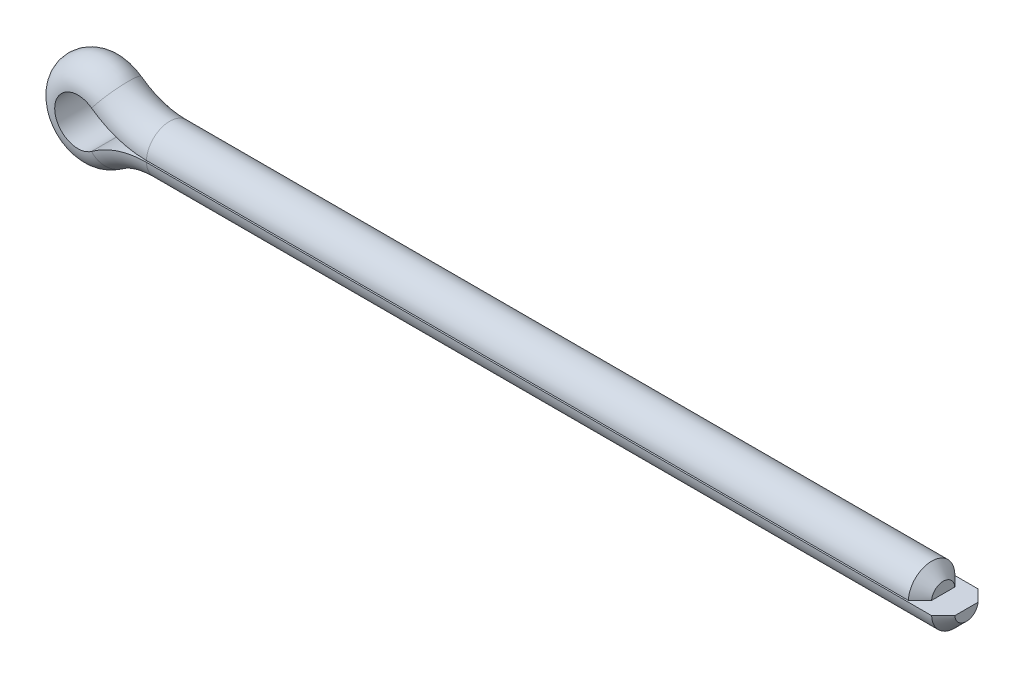
ISO-10303-21;
HEADER;
FILE_DESCRIPTION(('STEP AP214'),'2;1');
FILE_NAME('part.step','',(''),(''),'','','');
FILE_SCHEMA(('AUTOMOTIVE_DESIGN { 1 0 10303 214 1 1 1 1 }'));
ENDSEC;
DATA;
#1=APPLICATION_CONTEXT('core data for automotive mechanical design processes');
#2=APPLICATION_PROTOCOL_DEFINITION('international standard','automotive_design',2000,#1);
#3=PRODUCT_CONTEXT('',#1,'mechanical');
#4=PRODUCT('Part','Part','',(#3));
#5=PRODUCT_RELATED_PRODUCT_CATEGORY('part','',(#4));
#6=PRODUCT_DEFINITION_FORMATION('','',#4);
#7=PRODUCT_DEFINITION_CONTEXT('part definition',#1,'design');
#8=PRODUCT_DEFINITION('design','',#6,#7);
#9=PRODUCT_DEFINITION_SHAPE('','',#8);
#10=(LENGTH_UNIT() NAMED_UNIT(*) SI_UNIT(.MILLI.,.METRE.));
#11=(NAMED_UNIT(*) PLANE_ANGLE_UNIT() SI_UNIT($,.RADIAN.));
#12=(NAMED_UNIT(*) SI_UNIT($,.STERADIAN.) SOLID_ANGLE_UNIT());
#13=UNCERTAINTY_MEASURE_WITH_UNIT(LENGTH_MEASURE(1.E-05),#10,'distance_accuracy_value','');
#14=(GEOMETRIC_REPRESENTATION_CONTEXT(3) GLOBAL_UNCERTAINTY_ASSIGNED_CONTEXT((#13)) GLOBAL_UNIT_ASSIGNED_CONTEXT((#10,
#11,#12)) REPRESENTATION_CONTEXT('',''));
#15=CARTESIAN_POINT('',(0.,0.,0.));
#16=DIRECTION('',(0.,0.,1.));
#17=DIRECTION('',(1.,0.,0.));
#18=AXIS2_PLACEMENT_3D('',#15,#16,#17);
#19=CARTESIAN_POINT('',(0.761999999999992,0.,0.));
#20=DIRECTION('',(-1.,0.,0.));
#21=DIRECTION('',(0.,0.,-1.));
#22=AXIS2_PLACEMENT_3D('',#19,#20,#21);
#23=PLANE('',#22);
#24=DIRECTION('',(0.,0.,-1.));
#25=VECTOR('',#24,1.);
#26=CARTESIAN_POINT('',(0.761999999999992,-0.0254,0.761576549008699));
#27=LINE('',#26,#25);
#28=CARTESIAN_POINT('',(0.761999999999992,-0.0254,0.380152390496232));
#29=VERTEX_POINT('',#28);
#30=CARTESIAN_POINT('',(0.761999999999992,-0.0253999999999999,-0.380152390496232));
#31=VERTEX_POINT('',#30);
#32=EDGE_CURVE('E153',#29,#31,#27,.T.);
#33=ORIENTED_EDGE('',*,*,#32,.F.);
#34=CARTESIAN_POINT('',(0.761999999999992,0.,0.));
#35=DIRECTION('',(-1.,0.,0.));
#36=DIRECTION('',(0.,-1.,0.));
#37=AXIS2_PLACEMENT_3D('',#34,#35,#36);
#38=CIRCLE('',#37,0.380999999999999);
#39=EDGE_CURVE('E291',#29,#31,#38,.F.);
#40=ORIENTED_EDGE('',*,*,#39,.T.);
#41=EDGE_LOOP('',(#33,#40));
#42=FACE_BOUND('',#41,.T.);
#43=ADVANCED_FACE('F73',(#42),#23,.F.);
#44=CARTESIAN_POINT('',(0.,0.,0.));
#45=DIRECTION('',(1.,0.,0.));
#46=DIRECTION('',(0.,0.,-1.));
#47=AXIS2_PLACEMENT_3D('',#44,#45,#46);
#48=PLANE('',#47);
#49=DIRECTION('',(0.,0.,-1.));
#50=VECTOR('',#49,1.);
#51=CARTESIAN_POINT('',(0.,0.0254,0.761576549008699));
#52=LINE('',#51,#50);
#53=CARTESIAN_POINT('',(0.,0.0254,0.380152390496235));
#54=VERTEX_POINT('',#53);
#55=CARTESIAN_POINT('',(0.,0.0253999999999999,-0.380152390496235));
#56=VERTEX_POINT('',#55);
#57=EDGE_CURVE('E214',#54,#56,#52,.T.);
#58=ORIENTED_EDGE('',*,*,#57,.T.);
#59=CARTESIAN_POINT('',(0.,0.,0.));
#60=DIRECTION('',(1.,0.,0.));
#61=DIRECTION('',(0.,0.,-1.));
#62=AXIS2_PLACEMENT_3D('',#59,#60,#61);
#63=CIRCLE('',#62,0.381000000000003);
#64=EDGE_CURVE('E286',#56,#54,#63,.T.);
#65=ORIENTED_EDGE('',*,*,#64,.T.);
#66=EDGE_LOOP('',(#58,#65));
#67=FACE_BOUND('',#66,.T.);
#68=ADVANCED_FACE('F260',(#67),#48,.T.);
#69=CARTESIAN_POINT('',(0.761999999999992,0.,0.));
#70=DIRECTION('',(-1.,0.,0.));
#71=DIRECTION('',(0.,-1.,0.));
#72=AXIS2_PLACEMENT_3D('',#69,#70,#71);
#73=CYLINDRICAL_SURFACE('',#72,0.761999999999999);
#74=DIRECTION('',(-1.,0.,0.));
#75=VECTOR('',#74,1.);
#76=CARTESIAN_POINT('',(0.761999999999992,-0.0253999999999999,-0.761576549008699));
#77=LINE('',#76,#75);
#78=CARTESIAN_POINT('',(0.380999999999991,-0.0253999999999998,-0.761576549008699));
#79=VERTEX_POINT('',#78);
#80=CARTESIAN_POINT('',(-25.4,-0.0253999999999973,-0.761576549008699));
#81=VERTEX_POINT('',#80);
#82=EDGE_CURVE('E137',#79,#81,#77,.T.);
#83=ORIENTED_EDGE('',*,*,#82,.F.);
#84=CARTESIAN_POINT('',(0.380999999999991,0.,0.));
#85=DIRECTION('',(-1.,0.,0.));
#86=DIRECTION('',(0.,-1.,0.));
#87=AXIS2_PLACEMENT_3D('',#84,#85,#86);
#88=CIRCLE('',#87,0.761999999999999);
#89=CARTESIAN_POINT('',(0.380999999999991,-0.0254,0.761576549008699));
#90=VERTEX_POINT('',#89);
#91=EDGE_CURVE('E232',#79,#90,#88,.T.);
#92=ORIENTED_EDGE('',*,*,#91,.T.);
#93=DIRECTION('',(-1.,0.,0.));
#94=VECTOR('',#93,1.);
#95=CARTESIAN_POINT('',(0.761999999999992,-0.0254,0.761576549008699));
#96=LINE('',#95,#94);
#97=CARTESIAN_POINT('',(-25.4,-0.0253999999999975,0.761576549008699));
#98=VERTEX_POINT('',#97);
#99=EDGE_CURVE('E171',#90,#98,#96,.T.);
#100=ORIENTED_EDGE('',*,*,#99,.T.);
#101=CARTESIAN_POINT('',(-25.4,0.,0.));
#102=DIRECTION('',(-1.,0.,0.));
#103=DIRECTION('',(0.,0.,-1.));
#104=AXIS2_PLACEMENT_3D('',#101,#102,#103);
#105=CIRCLE('',#104,0.761999999999999);
#106=EDGE_CURVE('E152',#81,#98,#105,.T.);
#107=ORIENTED_EDGE('',*,*,#106,.F.);
#108=EDGE_LOOP('',(#83,#92,#100,#107));
#109=FACE_BOUND('',#108,.T.);
#110=ADVANCED_FACE('F173',(#109),#73,.T.);
#111=CARTESIAN_POINT('',(0.761999999999992,-0.0254,0.761576549008699));
#112=DIRECTION('',(0.,1.,0.));
#113=DIRECTION('',(0.,0.,1.));
#114=AXIS2_PLACEMENT_3D('',#111,#112,#113);
#115=PLANE('',#114);
#116=ORIENTED_EDGE('',*,*,#99,.F.);
#117=CARTESIAN_POINT('',(0.380999999999991,-0.0254,0.761576549008699));
#118=CARTESIAN_POINT('',(0.444523602983837,-0.0254,0.698029434118925));
#119=CARTESIAN_POINT('',(0.508035404111089,-0.0254,0.634470530496681));
#120=CARTESIAN_POINT('',(0.635035404111632,-0.0254,0.507329144326401));
#121=CARTESIAN_POINT('',(0.69852360298438,-0.0254,0.443746661777822));
#122=CARTESIAN_POINT('',(0.761999999999992,-0.0254,0.380152390496232));
#123=B_SPLINE_CURVE_WITH_KNOTS('',3,(#117,#118,#119,#120,#121,#122),.UNSPECIFIED.,.F.,.F.,(4,2,
4),(0.,0.269557689574613,0.539115385343651),.UNSPECIFIED.);
#124=EDGE_CURVE('E242',#90,#29,#123,.T.);
#125=ORIENTED_EDGE('',*,*,#124,.T.);
#126=ORIENTED_EDGE('',*,*,#32,.T.);
#127=CARTESIAN_POINT('',(0.761999999999992,-0.0253999999999999,-0.380152390496232));
#128=CARTESIAN_POINT('',(0.656880354086044,-0.0253999999999999,-0.485453197874022));
#129=CARTESIAN_POINT('',(0.551734160368141,-0.0253999999999998,-0.590727481670877));
#130=CARTESIAN_POINT('',(0.424708758686153,-0.0253999999999998,-0.717843489336976));
#131=CARTESIAN_POINT('',(0.402854952404056,-0.0253999999999998,-0.739710591710943));
#132=CARTESIAN_POINT('',(0.380999999999993,-0.0253999999999998,-0.7615765490087));
#133=B_SPLINE_CURVE_WITH_KNOTS('',3,(#127,#128,#129,#130,#131,#132),.UNSPECIFIED.,.F.,.F.,(4,2,
4),(0.,0.4463693223562,0.539115379616014),.UNSPECIFIED.);
#134=EDGE_CURVE('E146',#31,#79,#133,.T.);
#135=ORIENTED_EDGE('',*,*,#134,.T.);
#136=ORIENTED_EDGE('',*,*,#82,.T.);
#137=DIRECTION('',(0.,0.,-1.));
#138=VECTOR('',#137,1.);
#139=CARTESIAN_POINT('',(-25.4,-0.0253999999999975,0.761576549008699));
#140=LINE('',#139,#138);
#141=EDGE_CURVE('E142',#98,#81,#140,.T.);
#142=ORIENTED_EDGE('',*,*,#141,.F.);
#143=EDGE_LOOP('',(#116,#125,#126,#135,#136,#142));
#144=FACE_BOUND('',#143,.T.);
#145=ADVANCED_FACE('F140',(#144),#115,.T.);
#146=CARTESIAN_POINT('',(-25.4,-3.0734,0.));
#147=DIRECTION('',(0.,0.,1.));
#148=DIRECTION('',(1.,0.,0.));
#149=AXIS2_PLACEMENT_3D('',#146,#147,#148);
#150=TOROIDAL_SURFACE('',#149,3.0734,0.761999999999999);
#151=CARTESIAN_POINT('',(-25.4,-3.0734,0.761576549008699));
#152=DIRECTION('',(0.,0.,1.));
#153=DIRECTION('',(0.,1.,0.));
#154=AXIS2_PLACEMENT_3D('',#151,#152,#153);
#155=CIRCLE('',#154,3.048);
#156=CARTESIAN_POINT('',(-27.2013883428067,-0.614680000000002,0.761576549008699));
#157=VERTEX_POINT('',#156);
#158=EDGE_CURVE('E169',#98,#157,#155,.T.);
#159=ORIENTED_EDGE('',*,*,#158,.T.);
#160=CARTESIAN_POINT('',(-27.2163999123301,-0.594190666666669,0.));
#161=DIRECTION('',(-0.806666666666665,-0.591006674149194,0.));
#162=DIRECTION('',(0.,0.,-1.));
#163=AXIS2_PLACEMENT_3D('',#160,#161,#162);
#164=CIRCLE('',#163,0.761999999999999);
#165=CARTESIAN_POINT('',(-27.2013883428067,-0.614680000000002,-0.761576549008699));
#166=VERTEX_POINT('',#165);
#167=EDGE_CURVE('E162',#166,#157,#164,.T.);
#168=ORIENTED_EDGE('',*,*,#167,.F.);
#169=CARTESIAN_POINT('',(-25.4,-3.0734,-0.761576549008699));
#170=DIRECTION('',(0.,0.,1.));
#171=DIRECTION('',(0.,1.,0.));
#172=AXIS2_PLACEMENT_3D('',#169,#170,#171);
#173=CIRCLE('',#172,3.048);
#174=EDGE_CURVE('E158',#81,#166,#173,.T.);
#175=ORIENTED_EDGE('',*,*,#174,.F.);
#176=ORIENTED_EDGE('',*,*,#106,.T.);
#177=EDGE_LOOP('',(#159,#168,#175,#176));
#178=FACE_BOUND('',#177,.T.);
#179=ADVANCED_FACE('F160',(#178),#150,.T.);
#180=CARTESIAN_POINT('',(-25.4,-3.0734,0.));
#181=DIRECTION('',(0.,0.,1.));
#182=DIRECTION('',(1.,0.,0.));
#183=AXIS2_PLACEMENT_3D('',#180,#181,#182);
#184=CYLINDRICAL_SURFACE('',#183,3.048);
#185=DIRECTION('',(0.,0.,-1.));
#186=VECTOR('',#185,1.);
#187=CARTESIAN_POINT('',(-27.2013883428067,-0.614680000000002,0.761576549008699));
#188=LINE('',#187,#186);
#189=EDGE_CURVE('E183',#157,#166,#188,.T.);
#190=ORIENTED_EDGE('',*,*,#189,.F.);
#191=ORIENTED_EDGE('',*,*,#158,.F.);
#192=ORIENTED_EDGE('',*,*,#141,.T.);
#193=ORIENTED_EDGE('',*,*,#174,.T.);
#194=EDGE_LOOP('',(#190,#191,#192,#193));
#195=FACE_BOUND('',#194,.T.);
#196=ADVANCED_FACE('F168',(#195),#184,.T.);
#197=CARTESIAN_POINT('',(-27.6517354285084,0.,0.));
#198=DIRECTION('',(0.,0.,-1.));
#199=DIRECTION('',(-1.,0.,0.));
#200=AXIS2_PLACEMENT_3D('',#197,#198,#199);
#201=DEGENERATE_TOROIDAL_SURFACE('',#200,0.736600000000002,0.761999999999999,.T.);
#202=CARTESIAN_POINT('',(-27.6517354285084,0.,0.761576549008699));
#203=DIRECTION('',(0.,0.,-1.));
#204=DIRECTION('',(0.591006674149192,-0.806666666666666,0.));
#205=AXIS2_PLACEMENT_3D('',#202,#203,#204);
#206=CIRCLE('',#205,0.762000000000002);
#207=CARTESIAN_POINT('',(-27.2013883428067,0.614680000000002,0.761576549008699));
#208=VERTEX_POINT('',#207);
#209=EDGE_CURVE('E189',#157,#208,#206,.T.);
#210=ORIENTED_EDGE('',*,*,#209,.T.);
#211=CARTESIAN_POINT('',(-27.2163999123301,0.594190666666668,0.));
#212=DIRECTION('',(0.806666666666666,-0.591006674149192,0.));
#213=DIRECTION('',(0.,0.,-1.));
#214=AXIS2_PLACEMENT_3D('',#211,#212,#213);
#215=CIRCLE('',#214,0.761999999999999);
#216=CARTESIAN_POINT('',(-27.2013883428067,0.614680000000002,-0.761576549008699));
#217=VERTEX_POINT('',#216);
#218=EDGE_CURVE('E185',#217,#208,#215,.T.);
#219=ORIENTED_EDGE('',*,*,#218,.F.);
#220=CARTESIAN_POINT('',(-27.6517354285084,0.,-0.761576549008699));
#221=DIRECTION('',(0.,0.,-1.));
#222=DIRECTION('',(0.591006674149192,-0.806666666666666,0.));
#223=AXIS2_PLACEMENT_3D('',#220,#221,#222);
#224=CIRCLE('',#223,0.762000000000002);
#225=EDGE_CURVE('E190',#166,#217,#224,.T.);
#226=ORIENTED_EDGE('',*,*,#225,.F.);
#227=ORIENTED_EDGE('',*,*,#167,.T.);
#228=EDGE_LOOP('',(#210,#219,#226,#227));
#229=FACE_BOUND('',#228,.T.);
#230=ADVANCED_FACE('F359',(#229),#201,.T.);
#231=CARTESIAN_POINT('',(-27.6517354285084,0.,0.));
#232=DIRECTION('',(0.,0.,-1.));
#233=DIRECTION('',(-1.,0.,0.));
#234=AXIS2_PLACEMENT_3D('',#231,#232,#233);
#235=CYLINDRICAL_SURFACE('',#234,0.762000000000002);
#236=DIRECTION('',(0.,0.,-1.));
#237=VECTOR('',#236,1.);
#238=CARTESIAN_POINT('',(-27.2013883428067,0.614680000000001,0.761576549008699));
#239=LINE('',#238,#237);
#240=EDGE_CURVE('E194',#208,#217,#239,.T.);
#241=ORIENTED_EDGE('',*,*,#240,.F.);
#242=ORIENTED_EDGE('',*,*,#209,.F.);
#243=ORIENTED_EDGE('',*,*,#189,.T.);
#244=ORIENTED_EDGE('',*,*,#225,.T.);
#245=EDGE_LOOP('',(#241,#242,#243,#244));
#246=FACE_BOUND('',#245,.T.);
#247=ADVANCED_FACE('F351',(#246),#235,.F.);
#248=CARTESIAN_POINT('',(-25.4,3.0734,0.));
#249=DIRECTION('',(0.,0.,1.));
#250=DIRECTION('',(1.,0.,0.));
#251=AXIS2_PLACEMENT_3D('',#248,#249,#250);
#252=TOROIDAL_SURFACE('',#251,3.0734,0.761999999999999);
#253=CARTESIAN_POINT('',(-25.4,3.0734,0.761576549008699));
#254=DIRECTION('',(0.,0.,1.));
#255=DIRECTION('',(-0.591006674149194,-0.806666666666665,0.));
#256=AXIS2_PLACEMENT_3D('',#253,#254,#255);
#257=CIRCLE('',#256,3.048);
#258=CARTESIAN_POINT('',(-25.4,0.0253999999999983,0.761576549008699));
#259=VERTEX_POINT('',#258);
#260=EDGE_CURVE('E202',#208,#259,#257,.T.);
#261=ORIENTED_EDGE('',*,*,#260,.T.);
#262=CARTESIAN_POINT('',(-25.4,0.,0.));
#263=DIRECTION('',(1.,0.,0.));
#264=DIRECTION('',(0.,0.,-1.));
#265=AXIS2_PLACEMENT_3D('',#262,#263,#264);
#266=CIRCLE('',#265,0.761999999999999);
#267=CARTESIAN_POINT('',(-25.4,0.0253999999999983,-0.761576549008699));
#268=VERTEX_POINT('',#267);
#269=EDGE_CURVE('E198',#268,#259,#266,.T.);
#270=ORIENTED_EDGE('',*,*,#269,.F.);
#271=CARTESIAN_POINT('',(-25.4,3.0734,-0.761576549008699));
#272=DIRECTION('',(0.,0.,1.));
#273=DIRECTION('',(-0.591006674149194,-0.806666666666665,0.));
#274=AXIS2_PLACEMENT_3D('',#271,#272,#273);
#275=CIRCLE('',#274,3.048);
#276=EDGE_CURVE('E203',#217,#268,#275,.T.);
#277=ORIENTED_EDGE('',*,*,#276,.F.);
#278=ORIENTED_EDGE('',*,*,#218,.T.);
#279=EDGE_LOOP('',(#261,#270,#277,#278));
#280=FACE_BOUND('',#279,.T.);
#281=ADVANCED_FACE('F343',(#280),#252,.T.);
#282=CARTESIAN_POINT('',(-25.4,3.0734,0.));
#283=DIRECTION('',(0.,0.,1.));
#284=DIRECTION('',(1.,0.,0.));
#285=AXIS2_PLACEMENT_3D('',#282,#283,#284);
#286=CYLINDRICAL_SURFACE('',#285,3.048);
#287=DIRECTION('',(0.,0.,-1.));
#288=VECTOR('',#287,1.);
#289=CARTESIAN_POINT('',(-25.4,0.0253999999999975,0.761576549008699));
#290=LINE('',#289,#288);
#291=EDGE_CURVE('E207',#259,#268,#290,.T.);
#292=ORIENTED_EDGE('',*,*,#291,.F.);
#293=ORIENTED_EDGE('',*,*,#260,.F.);
#294=ORIENTED_EDGE('',*,*,#240,.T.);
#295=ORIENTED_EDGE('',*,*,#276,.T.);
#296=EDGE_LOOP('',(#292,#293,#294,#295));
#297=FACE_BOUND('',#296,.T.);
#298=ADVANCED_FACE('F269',(#297),#286,.T.);
#299=CARTESIAN_POINT('',(-25.4,0.,0.));
#300=DIRECTION('',(1.,0.,0.));
#301=DIRECTION('',(0.,1.,0.));
#302=AXIS2_PLACEMENT_3D('',#299,#300,#301);
#303=CYLINDRICAL_SURFACE('',#302,0.761999999999999);
#304=DIRECTION('',(1.,0.,0.));
#305=VECTOR('',#304,1.);
#306=CARTESIAN_POINT('',(-25.4,0.0253999999999983,0.761576549008699));
#307=LINE('',#306,#305);
#308=CARTESIAN_POINT('',(-0.380999999999999,0.0254,0.761576549008699));
#309=VERTEX_POINT('',#308);
#310=EDGE_CURVE('E211',#259,#309,#307,.T.);
#311=ORIENTED_EDGE('',*,*,#310,.T.);
#312=CARTESIAN_POINT('',(-0.380999999999999,0.,0.));
#313=DIRECTION('',(1.,0.,0.));
#314=DIRECTION('',(0.,1.,0.));
#315=AXIS2_PLACEMENT_3D('',#312,#313,#314);
#316=CIRCLE('',#315,0.761999999999999);
#317=CARTESIAN_POINT('',(-0.380999999999999,0.0253999999999998,-0.761576549008699));
#318=VERTEX_POINT('',#317);
#319=EDGE_CURVE('E12',#309,#318,#316,.F.);
#320=ORIENTED_EDGE('',*,*,#319,.T.);
#321=DIRECTION('',(1.,0.,0.));
#322=VECTOR('',#321,1.);
#323=CARTESIAN_POINT('',(-25.4,0.0253999999999982,-0.761576549008699));
#324=LINE('',#323,#322);
#325=EDGE_CURVE('E215',#268,#318,#324,.T.);
#326=ORIENTED_EDGE('',*,*,#325,.F.);
#327=ORIENTED_EDGE('',*,*,#269,.T.);
#328=EDGE_LOOP('',(#311,#320,#326,#327));
#329=FACE_BOUND('',#328,.T.);
#330=ADVANCED_FACE('F268',(#329),#303,.T.);
#331=CARTESIAN_POINT('',(-25.4,0.0253999999999983,0.761576549008699));
#332=DIRECTION('',(0.,-1.,0.));
#333=DIRECTION('',(0.,0.,-1.));
#334=AXIS2_PLACEMENT_3D('',#331,#332,#333);
#335=PLANE('',#334);
#336=ORIENTED_EDGE('',*,*,#57,.F.);
#337=CARTESIAN_POINT('',(0.,0.0254,0.380152390496235));
#338=CARTESIAN_POINT('',(-0.105119645913949,0.0254,0.485453197874026));
#339=CARTESIAN_POINT('',(-0.210265839631853,0.0254,0.590727481670882));
#340=CARTESIAN_POINT('',(-0.337291241313841,0.0254,0.71784348933698));
#341=CARTESIAN_POINT('',(-0.359145047595937,0.0254,0.739710591710945));
#342=CARTESIAN_POINT('',(-0.380999999999998,0.0254,0.7615765490087));
#343=B_SPLINE_CURVE_WITH_KNOTS('',3,(#337,#338,#339,#340,#341,#342),.UNSPECIFIED.,.F.,.F.,(4,2,
4),(0.,0.446369322356204,0.539115379616011),.UNSPECIFIED.);
#344=EDGE_CURVE('E83',#54,#309,#343,.T.);
#345=ORIENTED_EDGE('',*,*,#344,.T.);
#346=ORIENTED_EDGE('',*,*,#310,.F.);
#347=ORIENTED_EDGE('',*,*,#291,.T.);
#348=ORIENTED_EDGE('',*,*,#325,.T.);
#349=CARTESIAN_POINT('',(-0.380999999999999,0.0253999999999998,-0.761576549008699));
#350=CARTESIAN_POINT('',(-0.317476397016154,0.0253999999999998,-0.698029434118926));
#351=CARTESIAN_POINT('',(-0.253964595888902,0.0253999999999998,-0.634470530496682));
#352=CARTESIAN_POINT('',(-0.12696459588836,0.0253999999999999,-0.507329144326403));
#353=CARTESIAN_POINT('',(-0.0634763970156115,0.0253999999999999,-0.443746661777825));
#354=CARTESIAN_POINT('',(0.,0.0253999999999999,-0.380152390496235));
#355=B_SPLINE_CURVE_WITH_KNOTS('',3,(#349,#350,#351,#352,#353,#354),.UNSPECIFIED.,.F.,.F.,(4,2,
4),(0.,0.269557689574612,0.539115385343648),.UNSPECIFIED.);
#356=EDGE_CURVE('E273',#318,#56,#355,.T.);
#357=ORIENTED_EDGE('',*,*,#356,.T.);
#358=EDGE_LOOP('',(#336,#345,#346,#347,#348,#357));
#359=FACE_BOUND('',#358,.T.);
#360=ADVANCED_FACE('F255',(#359),#335,.T.);
#361=CARTESIAN_POINT('',(0.380999999999991,0.,0.));
#362=DIRECTION('',(-1.,0.,0.));
#363=DIRECTION('',(0.,-1.,0.));
#364=AXIS2_PLACEMENT_3D('',#361,#362,#363);
#365=CONICAL_SURFACE('',#364,0.761999999999999,0.785398163397447);
#366=ORIENTED_EDGE('',*,*,#134,.F.);
#367=ORIENTED_EDGE('',*,*,#39,.F.);
#368=ORIENTED_EDGE('',*,*,#124,.F.);
#369=ORIENTED_EDGE('',*,*,#91,.F.);
#370=EDGE_LOOP('',(#366,#367,#368,#369));
#371=FACE_BOUND('',#370,.T.);
#372=ADVANCED_FACE('F251',(#371),#365,.T.);
#373=CARTESIAN_POINT('',(0.,0.,0.));
#374=DIRECTION('',(-1.,0.,0.));
#375=DIRECTION('',(0.,-1.,0.));
#376=AXIS2_PLACEMENT_3D('',#373,#374,#375);
#377=CONICAL_SURFACE('',#376,0.381000000000003,0.785398163397444);
#378=ORIENTED_EDGE('',*,*,#356,.F.);
#379=ORIENTED_EDGE('',*,*,#319,.F.);
#380=ORIENTED_EDGE('',*,*,#344,.F.);
#381=ORIENTED_EDGE('',*,*,#64,.F.);
#382=EDGE_LOOP('',(#378,#379,#380,#381));
#383=FACE_BOUND('',#382,.T.);
#384=ADVANCED_FACE('F75',(#383),#377,.T.);
#385=CLOSED_SHELL('',(#43,#68,#110,#145,#179,#196,#230,#247,#281,#298,#330,#360,#372,#384));
#386=MANIFOLD_SOLID_BREP('B2',#385);
#387=ADVANCED_BREP_SHAPE_REPRESENTATION('',(#18,#386),#14);
#388=SHAPE_DEFINITION_REPRESENTATION(#9,#387);
ENDSEC;
END-ISO-10303-21;
